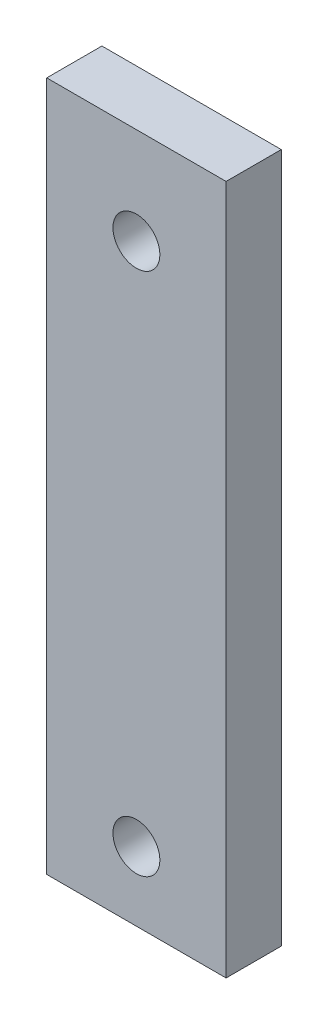
ISO-10303-21;
HEADER;
FILE_DESCRIPTION(('STEP AP214'),'2;1');
FILE_NAME('part.step','',(''),(''),'','','');
FILE_SCHEMA(('AUTOMOTIVE_DESIGN { 1 0 10303 214 1 1 1 1 }'));
ENDSEC;
DATA;
#1=APPLICATION_CONTEXT('core data for automotive mechanical design processes');
#2=APPLICATION_PROTOCOL_DEFINITION('international standard','automotive_design',2000,#1);
#3=PRODUCT_CONTEXT('',#1,'mechanical');
#4=PRODUCT('Part','Part','',(#3));
#5=PRODUCT_RELATED_PRODUCT_CATEGORY('part','',(#4));
#6=PRODUCT_DEFINITION_FORMATION('','',#4);
#7=PRODUCT_DEFINITION_CONTEXT('part definition',#1,'design');
#8=PRODUCT_DEFINITION('design','',#6,#7);
#9=PRODUCT_DEFINITION_SHAPE('','',#8);
#10=(LENGTH_UNIT() NAMED_UNIT(*) SI_UNIT(.MILLI.,.METRE.));
#11=(NAMED_UNIT(*) PLANE_ANGLE_UNIT() SI_UNIT($,.RADIAN.));
#12=(NAMED_UNIT(*) SI_UNIT($,.STERADIAN.) SOLID_ANGLE_UNIT());
#13=UNCERTAINTY_MEASURE_WITH_UNIT(LENGTH_MEASURE(1.E-05),#10,'distance_accuracy_value','');
#14=(GEOMETRIC_REPRESENTATION_CONTEXT(3) GLOBAL_UNCERTAINTY_ASSIGNED_CONTEXT((#13)) GLOBAL_UNIT_ASSIGNED_CONTEXT((#10,
#11,#12)) REPRESENTATION_CONTEXT('',''));
#15=CARTESIAN_POINT('',(0.,0.,0.));
#16=DIRECTION('',(0.,0.,1.));
#17=DIRECTION('',(1.,0.,0.));
#18=AXIS2_PLACEMENT_3D('',#15,#16,#17);
#19=CARTESIAN_POINT('',(32.5,125.,20.));
#20=DIRECTION('',(-1.,0.,0.));
#21=DIRECTION('',(0.,-1.,0.));
#22=AXIS2_PLACEMENT_3D('',#19,#20,#21);
#23=PLANE('',#22);
#24=DIRECTION('',(0.,1.,0.));
#25=VECTOR('',#24,1.);
#26=CARTESIAN_POINT('',(32.5,125.,0.));
#27=LINE('',#26,#25);
#28=CARTESIAN_POINT('',(32.5,-125.,0.));
#29=VERTEX_POINT('',#28);
#30=CARTESIAN_POINT('',(32.5,125.,0.));
#31=VERTEX_POINT('',#30);
#32=EDGE_CURVE('E96',#29,#31,#27,.T.);
#33=ORIENTED_EDGE('',*,*,#32,.T.);
#34=DIRECTION('',(0.,0.,-1.));
#35=VECTOR('',#34,1.);
#36=CARTESIAN_POINT('',(32.5,125.,20.));
#37=LINE('',#36,#35);
#38=CARTESIAN_POINT('',(32.5,125.,20.));
#39=VERTEX_POINT('',#38);
#40=EDGE_CURVE('E11',#39,#31,#37,.T.);
#41=ORIENTED_EDGE('',*,*,#40,.F.);
#42=DIRECTION('',(0.,1.,0.));
#43=VECTOR('',#42,1.);
#44=CARTESIAN_POINT('',(32.5,125.,20.));
#45=LINE('',#44,#43);
#46=CARTESIAN_POINT('',(32.5,-125.,20.));
#47=VERTEX_POINT('',#46);
#48=EDGE_CURVE('E84',#47,#39,#45,.T.);
#49=ORIENTED_EDGE('',*,*,#48,.F.);
#50=DIRECTION('',(0.,0.,-1.));
#51=VECTOR('',#50,1.);
#52=CARTESIAN_POINT('',(32.5,-125.,20.));
#53=LINE('',#52,#51);
#54=EDGE_CURVE('E92',#47,#29,#53,.T.);
#55=ORIENTED_EDGE('',*,*,#54,.T.);
#56=EDGE_LOOP('',(#33,#41,#49,#55));
#57=FACE_BOUND('',#56,.T.);
#58=ADVANCED_FACE('F33',(#57),#23,.F.);
#59=CARTESIAN_POINT('',(-32.5,125.,20.));
#60=DIRECTION('',(0.,-1.,0.));
#61=DIRECTION('',(1.,0.,0.));
#62=AXIS2_PLACEMENT_3D('',#59,#60,#61);
#63=PLANE('',#62);
#64=DIRECTION('',(-1.,0.,0.));
#65=VECTOR('',#64,1.);
#66=CARTESIAN_POINT('',(-32.5,125.,0.));
#67=LINE('',#66,#65);
#68=CARTESIAN_POINT('',(-32.5,125.,0.));
#69=VERTEX_POINT('',#68);
#70=EDGE_CURVE('E88',#31,#69,#67,.T.);
#71=ORIENTED_EDGE('',*,*,#70,.T.);
#72=DIRECTION('',(0.,0.,-1.));
#73=VECTOR('',#72,1.);
#74=CARTESIAN_POINT('',(-32.5,125.,20.));
#75=LINE('',#74,#73);
#76=CARTESIAN_POINT('',(-32.5,125.,20.));
#77=VERTEX_POINT('',#76);
#78=EDGE_CURVE('E41',#77,#69,#75,.T.);
#79=ORIENTED_EDGE('',*,*,#78,.F.);
#80=DIRECTION('',(-1.,0.,0.));
#81=VECTOR('',#80,1.);
#82=CARTESIAN_POINT('',(-32.5,125.,20.));
#83=LINE('',#82,#81);
#84=EDGE_CURVE('E79',#39,#77,#83,.T.);
#85=ORIENTED_EDGE('',*,*,#84,.F.);
#86=ORIENTED_EDGE('',*,*,#40,.T.);
#87=EDGE_LOOP('',(#71,#79,#85,#86));
#88=FACE_BOUND('',#87,.T.);
#89=ADVANCED_FACE('F87',(#88),#63,.F.);
#90=CARTESIAN_POINT('',(-32.5,125.,20.));
#91=DIRECTION('',(1.,0.,0.));
#92=DIRECTION('',(0.,1.,0.));
#93=AXIS2_PLACEMENT_3D('',#90,#91,#92);
#94=PLANE('',#93);
#95=DIRECTION('',(0.,-1.,0.));
#96=VECTOR('',#95,1.);
#97=CARTESIAN_POINT('',(-32.5,125.,0.));
#98=LINE('',#97,#96);
#99=CARTESIAN_POINT('',(-32.5,-125.,0.));
#100=VERTEX_POINT('',#99);
#101=EDGE_CURVE('E66',#69,#100,#98,.T.);
#102=ORIENTED_EDGE('',*,*,#101,.T.);
#103=DIRECTION('',(0.,0.,-1.));
#104=VECTOR('',#103,1.);
#105=CARTESIAN_POINT('',(-32.5,-125.,20.));
#106=LINE('',#105,#104);
#107=CARTESIAN_POINT('',(-32.5,-125.,20.));
#108=VERTEX_POINT('',#107);
#109=EDGE_CURVE('E89',#108,#100,#106,.T.);
#110=ORIENTED_EDGE('',*,*,#109,.F.);
#111=DIRECTION('',(0.,-1.,0.));
#112=VECTOR('',#111,1.);
#113=CARTESIAN_POINT('',(-32.5,125.,20.));
#114=LINE('',#113,#112);
#115=EDGE_CURVE('E82',#77,#108,#114,.T.);
#116=ORIENTED_EDGE('',*,*,#115,.F.);
#117=ORIENTED_EDGE('',*,*,#78,.T.);
#118=EDGE_LOOP('',(#102,#110,#116,#117));
#119=FACE_BOUND('',#118,.T.);
#120=ADVANCED_FACE('F90',(#119),#94,.F.);
#121=CARTESIAN_POINT('',(-32.5,-125.,20.));
#122=DIRECTION('',(0.,1.,0.));
#123=DIRECTION('',(0.,0.,1.));
#124=AXIS2_PLACEMENT_3D('',#121,#122,#123);
#125=PLANE('',#124);
#126=DIRECTION('',(1.,0.,0.));
#127=VECTOR('',#126,1.);
#128=CARTESIAN_POINT('',(-32.5,-125.,0.));
#129=LINE('',#128,#127);
#130=EDGE_CURVE('E72',#100,#29,#129,.T.);
#131=ORIENTED_EDGE('',*,*,#130,.T.);
#132=ORIENTED_EDGE('',*,*,#54,.F.);
#133=DIRECTION('',(1.,0.,0.));
#134=VECTOR('',#133,1.);
#135=CARTESIAN_POINT('',(-32.5,-125.,20.));
#136=LINE('',#135,#134);
#137=EDGE_CURVE('E49',#108,#47,#136,.T.);
#138=ORIENTED_EDGE('',*,*,#137,.F.);
#139=ORIENTED_EDGE('',*,*,#109,.T.);
#140=EDGE_LOOP('',(#131,#132,#138,#139));
#141=FACE_BOUND('',#140,.T.);
#142=ADVANCED_FACE('F104',(#141),#125,.F.);
#143=CARTESIAN_POINT('',(0.,0.,20.));
#144=DIRECTION('',(0.,0.,1.));
#145=DIRECTION('',(1.,0.,0.));
#146=AXIS2_PLACEMENT_3D('',#143,#144,#145);
#147=PLANE('',#146);
#148=CARTESIAN_POINT('',(0.,90.,20.));
#149=DIRECTION('',(0.,0.,1.));
#150=DIRECTION('',(1.,0.,0.));
#151=AXIS2_PLACEMENT_3D('',#148,#149,#150);
#152=CIRCLE('',#151,8.50000000000001);
#153=CARTESIAN_POINT('',(8.50000000000001,90.,20.));
#154=VERTEX_POINT('',#153);
#155=EDGE_CURVE('E115',#154,#154,#152,.F.);
#156=ORIENTED_EDGE('',*,*,#155,.T.);
#157=EDGE_LOOP('',(#156));
#158=FACE_BOUND('',#157,.T.);
#159=CARTESIAN_POINT('',(0.,-100.,20.));
#160=DIRECTION('',(0.,0.,1.));
#161=DIRECTION('',(1.,0.,0.));
#162=AXIS2_PLACEMENT_3D('',#159,#160,#161);
#163=CIRCLE('',#162,8.5);
#164=CARTESIAN_POINT('',(8.5,-100.,20.));
#165=VERTEX_POINT('',#164);
#166=EDGE_CURVE('E99',#165,#165,#163,.F.);
#167=ORIENTED_EDGE('',*,*,#166,.T.);
#168=EDGE_LOOP('',(#167));
#169=FACE_BOUND('',#168,.T.);
#170=ORIENTED_EDGE('',*,*,#48,.T.);
#171=ORIENTED_EDGE('',*,*,#84,.T.);
#172=ORIENTED_EDGE('',*,*,#115,.T.);
#173=ORIENTED_EDGE('',*,*,#137,.T.);
#174=EDGE_LOOP('',(#170,#171,#172,#173));
#175=FACE_BOUND('',#174,.T.);
#176=ADVANCED_FACE('F80',(#158,#169,#175),#147,.T.);
#177=CARTESIAN_POINT('',(0.,0.,0.));
#178=DIRECTION('',(0.,0.,1.));
#179=DIRECTION('',(1.,0.,0.));
#180=AXIS2_PLACEMENT_3D('',#177,#178,#179);
#181=PLANE('',#180);
#182=CARTESIAN_POINT('',(0.,90.,0.));
#183=DIRECTION('',(0.,0.,1.));
#184=DIRECTION('',(1.,0.,0.));
#185=AXIS2_PLACEMENT_3D('',#182,#183,#184);
#186=CIRCLE('',#185,8.50000000000001);
#187=CARTESIAN_POINT('',(8.50000000000001,90.,0.));
#188=VERTEX_POINT('',#187);
#189=EDGE_CURVE('E118',#188,#188,#186,.T.);
#190=ORIENTED_EDGE('',*,*,#189,.T.);
#191=EDGE_LOOP('',(#190));
#192=FACE_BOUND('',#191,.T.);
#193=CARTESIAN_POINT('',(0.,-100.,0.));
#194=DIRECTION('',(0.,0.,1.));
#195=DIRECTION('',(1.,0.,0.));
#196=AXIS2_PLACEMENT_3D('',#193,#194,#195);
#197=CIRCLE('',#196,8.5);
#198=CARTESIAN_POINT('',(8.5,-100.,0.));
#199=VERTEX_POINT('',#198);
#200=EDGE_CURVE('E112',#199,#199,#197,.T.);
#201=ORIENTED_EDGE('',*,*,#200,.T.);
#202=EDGE_LOOP('',(#201));
#203=FACE_BOUND('',#202,.T.);
#204=ORIENTED_EDGE('',*,*,#32,.F.);
#205=ORIENTED_EDGE('',*,*,#130,.F.);
#206=ORIENTED_EDGE('',*,*,#101,.F.);
#207=ORIENTED_EDGE('',*,*,#70,.F.);
#208=EDGE_LOOP('',(#204,#205,#206,#207));
#209=FACE_BOUND('',#208,.T.);
#210=ADVANCED_FACE('F107',(#192,#203,#209),#181,.F.);
#211=CARTESIAN_POINT('',(0.,-100.,28.));
#212=DIRECTION('',(0.,0.,-1.));
#213=DIRECTION('',(-1.,0.,0.));
#214=AXIS2_PLACEMENT_3D('',#211,#212,#213);
#215=CYLINDRICAL_SURFACE('',#214,8.5);
#216=ORIENTED_EDGE('',*,*,#166,.F.);
#217=EDGE_LOOP('',(#216));
#218=FACE_BOUND('',#217,.T.);
#219=ORIENTED_EDGE('',*,*,#200,.F.);
#220=EDGE_LOOP('',(#219));
#221=FACE_BOUND('',#220,.T.);
#222=ADVANCED_FACE('F126',(#218,#221),#215,.F.);
#223=CARTESIAN_POINT('',(0.,90.,28.));
#224=DIRECTION('',(0.,0.,-1.));
#225=DIRECTION('',(-1.,0.,0.));
#226=AXIS2_PLACEMENT_3D('',#223,#224,#225);
#227=CYLINDRICAL_SURFACE('',#226,8.50000000000001);
#228=ORIENTED_EDGE('',*,*,#155,.F.);
#229=EDGE_LOOP('',(#228));
#230=FACE_BOUND('',#229,.T.);
#231=ORIENTED_EDGE('',*,*,#189,.F.);
#232=EDGE_LOOP('',(#231));
#233=FACE_BOUND('',#232,.T.);
#234=ADVANCED_FACE('F124',(#230,#233),#227,.F.);
#235=CLOSED_SHELL('',(#58,#89,#120,#142,#176,#210,#222,#234));
#236=MANIFOLD_SOLID_BREP('B2',#235);
#237=ADVANCED_BREP_SHAPE_REPRESENTATION('',(#18,#236),#14);
#238=SHAPE_DEFINITION_REPRESENTATION(#9,#237);
ENDSEC;
END-ISO-10303-21;
